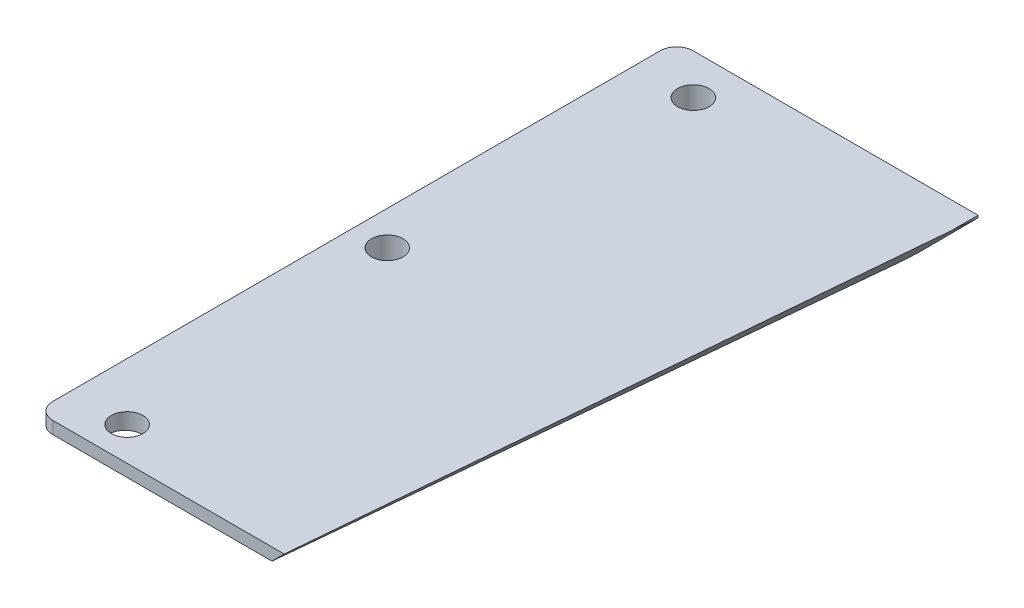
ISO-10303-21;
HEADER;
FILE_DESCRIPTION(('STEP AP214'),'2;1');
FILE_NAME('part.step','',(''),(''),'','','');
FILE_SCHEMA(('AUTOMOTIVE_DESIGN { 1 0 10303 214 1 1 1 1 }'));
ENDSEC;
DATA;
#1=APPLICATION_CONTEXT('core data for automotive mechanical design processes');
#2=APPLICATION_PROTOCOL_DEFINITION('international standard','automotive_design',2000,#1);
#3=PRODUCT_CONTEXT('',#1,'mechanical');
#4=PRODUCT('Part','Part','',(#3));
#5=PRODUCT_RELATED_PRODUCT_CATEGORY('part','',(#4));
#6=PRODUCT_DEFINITION_FORMATION('','',#4);
#7=PRODUCT_DEFINITION_CONTEXT('part definition',#1,'design');
#8=PRODUCT_DEFINITION('design','',#6,#7);
#9=PRODUCT_DEFINITION_SHAPE('','',#8);
#10=(LENGTH_UNIT() NAMED_UNIT(*) SI_UNIT(.MILLI.,.METRE.));
#11=(NAMED_UNIT(*) PLANE_ANGLE_UNIT() SI_UNIT($,.RADIAN.));
#12=(NAMED_UNIT(*) SI_UNIT($,.STERADIAN.) SOLID_ANGLE_UNIT());
#13=UNCERTAINTY_MEASURE_WITH_UNIT(LENGTH_MEASURE(1.E-05),#10,'distance_accuracy_value','');
#14=(GEOMETRIC_REPRESENTATION_CONTEXT(3) GLOBAL_UNCERTAINTY_ASSIGNED_CONTEXT((#13)) GLOBAL_UNIT_ASSIGNED_CONTEXT((#10,
#11,#12)) REPRESENTATION_CONTEXT('',''));
#15=CARTESIAN_POINT('',(0.,0.,0.));
#16=DIRECTION('',(0.,0.,1.));
#17=DIRECTION('',(1.,0.,0.));
#18=AXIS2_PLACEMENT_3D('',#15,#16,#17);
#19=CARTESIAN_POINT('',(-16.3293956239181,-151.252247056961,-104.155083501279));
#20=DIRECTION('',(1.,0.,0.));
#21=DIRECTION('',(0.,0.,-1.));
#22=AXIS2_PLACEMENT_3D('',#19,#20,#21);
#23=PLANE('',#22);
#24=DIRECTION('',(0.,1.,0.));
#25=VECTOR('',#24,1.);
#26=CARTESIAN_POINT('',(-16.3293956239181,-151.252247056961,-101.155083501279));
#27=LINE('',#26,#25);
#28=CARTESIAN_POINT('',(-16.3293956239181,-14.5,-101.155083501279));
#29=VERTEX_POINT('',#28);
#30=CARTESIAN_POINT('',(-16.3293956239181,-25.3162689580324,-101.155083501279));
#31=VERTEX_POINT('',#30);
#32=EDGE_CURVE('E132',#29,#31,#27,.F.);
#33=ORIENTED_EDGE('',*,*,#32,.T.);
#34=DIRECTION('',(0.,0.0871557427476512,0.996194698091746));
#35=VECTOR('',#34,1.);
#36=CARTESIAN_POINT('',(-16.3293956239181,-15.6285468939076,9.57608638633593));
#37=LINE('',#36,#35);
#38=CARTESIAN_POINT('',(-16.3293956239181,-15.6179891752357,9.69676166295296));
#39=VERTEX_POINT('',#38);
#40=EDGE_CURVE('E144',#31,#39,#37,.T.);
#41=ORIENTED_EDGE('',*,*,#40,.T.);
#42=DIRECTION('',(0.,1.,0.));
#43=VECTOR('',#42,1.);
#44=CARTESIAN_POINT('',(-16.3293956239181,-151.252247056961,9.69676166295296));
#45=LINE('',#44,#43);
#46=CARTESIAN_POINT('',(-16.3293956239181,-14.5,9.69676166295293));
#47=VERTEX_POINT('',#46);
#48=EDGE_CURVE('E136',#39,#47,#45,.T.);
#49=ORIENTED_EDGE('',*,*,#48,.T.);
#50=DIRECTION('',(0.,0.,-1.));
#51=VECTOR('',#50,1.);
#52=CARTESIAN_POINT('',(-16.3293956239181,-14.5,-104.155083501279));
#53=LINE('',#52,#51);
#54=EDGE_CURVE('E117',#47,#29,#53,.T.);
#55=ORIENTED_EDGE('',*,*,#54,.T.);
#56=EDGE_LOOP('',(#33,#41,#49,#55));
#57=FACE_BOUND('',#56,.T.);
#58=ADVANCED_FACE('F34',(#57),#23,.F.);
#59=CARTESIAN_POINT('',(-16.3293956239181,-151.252247056961,-104.155083501279));
#60=DIRECTION('',(0.,0.,1.));
#61=DIRECTION('',(1.,0.,0.));
#62=AXIS2_PLACEMENT_3D('',#59,#60,#61);
#63=PLANE('',#62);
#64=DIRECTION('',(0.,1.,0.));
#65=VECTOR('',#64,1.);
#66=CARTESIAN_POINT('',(38.6706043760819,-151.252247056961,-104.155083501279));
#67=LINE('',#66,#65);
#68=CARTESIAN_POINT('',(38.6706043760819,-14.9227793401485,-104.155083501279));
#69=VERTEX_POINT('',#68);
#70=CARTESIAN_POINT('',(38.6706043760819,-14.5,-104.155083501279));
#71=VERTEX_POINT('',#70);
#72=EDGE_CURVE('E104',#69,#71,#67,.T.);
#73=ORIENTED_EDGE('',*,*,#72,.F.);
#74=DIRECTION('',(-0.705757556807956,-0.708453436019943,0.));
#75=VECTOR('',#74,1.);
#76=CARTESIAN_POINT('',(31.2945843551041,-22.3269745593229,-104.155083501279));
#77=LINE('',#76,#75);
#78=CARTESIAN_POINT('',(28.1648964232193,-25.4686173906688,-104.155083501279));
#79=VERTEX_POINT('',#78);
#80=EDGE_CURVE('E44',#69,#79,#77,.T.);
#81=ORIENTED_EDGE('',*,*,#80,.T.);
#82=DIRECTION('',(-1.,0.,0.));
#83=VECTOR('',#82,1.);
#84=CARTESIAN_POINT('',(-13.3293956239181,-25.4686173906688,-104.155083501279));
#85=LINE('',#84,#83);
#86=CARTESIAN_POINT('',(-13.3293956239181,-25.4686173906688,-104.155083501279));
#87=VERTEX_POINT('',#86);
#88=EDGE_CURVE('E211',#79,#87,#85,.T.);
#89=ORIENTED_EDGE('',*,*,#88,.T.);
#90=DIRECTION('',(0.,1.,0.));
#91=VECTOR('',#90,1.);
#92=CARTESIAN_POINT('',(-13.3293956239181,-151.252247056961,-104.155083501279));
#93=LINE('',#92,#91);
#94=CARTESIAN_POINT('',(-13.3293956239181,-14.5,-104.155083501279));
#95=VERTEX_POINT('',#94);
#96=EDGE_CURVE('E114',#87,#95,#93,.T.);
#97=ORIENTED_EDGE('',*,*,#96,.T.);
#98=DIRECTION('',(1.,0.,0.));
#99=VECTOR('',#98,1.);
#100=CARTESIAN_POINT('',(-16.3293956239181,-14.5,-104.155083501279));
#101=LINE('',#100,#99);
#102=EDGE_CURVE('E109',#95,#71,#101,.T.);
#103=ORIENTED_EDGE('',*,*,#102,.T.);
#104=EDGE_LOOP('',(#73,#81,#89,#97,#103));
#105=FACE_BOUND('',#104,.T.);
#106=ADVANCED_FACE('F112',(#105),#63,.F.);
#107=CARTESIAN_POINT('',(38.6706043760819,-151.252247056961,-104.155083501279));
#108=DIRECTION('',(-1.,0.,0.));
#109=DIRECTION('',(0.,0.,1.));
#110=AXIS2_PLACEMENT_3D('',#107,#108,#109);
#111=PLANE('',#110);
#112=DIRECTION('',(0.,0.,1.));
#113=VECTOR('',#112,1.);
#114=CARTESIAN_POINT('',(38.6706043760819,-14.5,-104.155083501279));
#115=LINE('',#114,#113);
#116=CARTESIAN_POINT('',(38.6706043760819,-14.5,-99.3226935308539));
#117=VERTEX_POINT('',#116);
#118=EDGE_CURVE('E108',#71,#117,#115,.T.);
#119=ORIENTED_EDGE('',*,*,#118,.T.);
#120=DIRECTION('',(0.,-0.0871557427476512,-0.996194698091746));
#121=VECTOR('',#120,1.);
#122=CARTESIAN_POINT('',(38.6706043760819,-14.8936057369507,-103.821627690868));
#123=LINE('',#122,#121);
#124=EDGE_CURVE('E59',#117,#69,#123,.T.);
#125=ORIENTED_EDGE('',*,*,#124,.T.);
#126=ORIENTED_EDGE('',*,*,#72,.T.);
#127=EDGE_LOOP('',(#119,#125,#126));
#128=FACE_BOUND('',#127,.T.);
#129=ADVANCED_FACE('F106',(#128),#111,.F.);
#130=CARTESIAN_POINT('',(-16.3293956239181,-151.252247056961,12.696761662953));
#131=DIRECTION('',(0.,0.,-1.));
#132=DIRECTION('',(-1.,0.,0.));
#133=AXIS2_PLACEMENT_3D('',#130,#131,#132);
#134=PLANE('',#133);
#135=DIRECTION('',(-1.,0.,0.));
#136=VECTOR('',#135,1.);
#137=CARTESIAN_POINT('',(-16.3293956239181,-16.7454056267128,12.696761662953));
#138=LINE('',#137,#136);
#139=CARTESIAN_POINT('',(26.6706043760817,-16.7454056267128,12.6967616629529));
#140=VERTEX_POINT('',#139);
#141=CARTESIAN_POINT('',(-13.3293956239181,-16.7454056267128,12.696761662953));
#142=VERTEX_POINT('',#141);
#143=EDGE_CURVE('E125',#140,#142,#138,.T.);
#144=ORIENTED_EDGE('',*,*,#143,.F.);
#145=DIRECTION('',(0.705757556807956,0.708453436019943,0.));
#146=VECTOR('',#145,1.);
#147=CARTESIAN_POINT('',(26.183015623075,-17.2348568895439,12.6967616629529));
#148=LINE('',#147,#146);
#149=CARTESIAN_POINT('',(28.9074655564783,-14.5,12.6967616629529));
#150=VERTEX_POINT('',#149);
#151=EDGE_CURVE('E286',#140,#150,#148,.T.);
#152=ORIENTED_EDGE('',*,*,#151,.T.);
#153=DIRECTION('',(-1.,0.,0.));
#154=VECTOR('',#153,1.);
#155=CARTESIAN_POINT('',(-16.3293956239181,-14.5,12.696761662953));
#156=LINE('',#155,#154);
#157=CARTESIAN_POINT('',(-13.3293956239181,-14.5,12.696761662953));
#158=VERTEX_POINT('',#157);
#159=EDGE_CURVE('E123',#150,#158,#156,.T.);
#160=ORIENTED_EDGE('',*,*,#159,.T.);
#161=DIRECTION('',(0.,1.,0.));
#162=VECTOR('',#161,1.);
#163=CARTESIAN_POINT('',(-13.3293956239181,-151.252247056961,12.696761662953));
#164=LINE('',#163,#162);
#165=EDGE_CURVE('E306',#158,#142,#164,.F.);
#166=ORIENTED_EDGE('',*,*,#165,.T.);
#167=EDGE_LOOP('',(#144,#152,#160,#166));
#168=FACE_BOUND('',#167,.T.);
#169=ADVANCED_FACE('F289',(#168),#134,.F.);
#170=CARTESIAN_POINT('',(0.,-14.5,0.));
#171=DIRECTION('',(0.,1.,0.));
#172=DIRECTION('',(0.,0.,1.));
#173=AXIS2_PLACEMENT_3D('',#170,#171,#172);
#174=PLANE('',#173);
#175=CARTESIAN_POINT('',(-5.89885344473759,-14.5,-96.7709474931016));
#176=DIRECTION('',(0.,1.,0.));
#177=DIRECTION('',(0.,0.,1.));
#178=AXIS2_PLACEMENT_3D('',#175,#176,#177);
#179=CIRCLE('',#178,2.87500000000001);
#180=CARTESIAN_POINT('',(-5.89885344473759,-14.5,-93.8959474931016));
#181=VERTEX_POINT('',#180);
#182=EDGE_CURVE('E220',#181,#181,#179,.T.);
#183=ORIENTED_EDGE('',*,*,#182,.F.);
#184=EDGE_LOOP('',(#183));
#185=FACE_BOUND('',#184,.T.);
#186=CARTESIAN_POINT('',(-10.082989452915,-14.5,-45.1025417506395));
#187=DIRECTION('',(0.,1.,0.));
#188=DIRECTION('',(0.,0.,1.));
#189=AXIS2_PLACEMENT_3D('',#186,#187,#188);
#190=CIRCLE('',#189,2.875);
#191=CARTESIAN_POINT('',(-10.082989452915,-14.5,-42.2275417506395));
#192=VERTEX_POINT('',#191);
#193=EDGE_CURVE('E337',#192,#192,#190,.T.);
#194=ORIENTED_EDGE('',*,*,#193,.F.);
#195=EDGE_LOOP('',(#194));
#196=FACE_BOUND('',#195,.T.);
#197=CARTESIAN_POINT('',(-5.89885344473759,-14.5,6.56586399182263));
#198=DIRECTION('',(0.,1.,0.));
#199=DIRECTION('',(0.,0.,1.));
#200=AXIS2_PLACEMENT_3D('',#197,#198,#199);
#201=CIRCLE('',#200,2.875);
#202=CARTESIAN_POINT('',(-5.89885344473759,-14.5,9.44086399182263));
#203=VERTEX_POINT('',#202);
#204=EDGE_CURVE('E340',#203,#203,#201,.T.);
#205=ORIENTED_EDGE('',*,*,#204,.F.);
#206=EDGE_LOOP('',(#205));
#207=FACE_BOUND('',#206,.T.);
#208=ORIENTED_EDGE('',*,*,#159,.F.);
#209=DIRECTION('',(0.0868265938642417,0.,-0.996223440096615));
#210=VECTOR('',#209,1.);
#211=CARTESIAN_POINT('',(29.7877895218845,-14.5,2.59617692059058));
#212=LINE('',#211,#210);
#213=EDGE_CURVE('E122',#150,#117,#212,.T.);
#214=ORIENTED_EDGE('',*,*,#213,.T.);
#215=ORIENTED_EDGE('',*,*,#118,.F.);
#216=ORIENTED_EDGE('',*,*,#102,.F.);
#217=CARTESIAN_POINT('',(-13.3293956239181,-14.5,-101.155083501279));
#218=DIRECTION('',(0.,1.,0.));
#219=DIRECTION('',(0.,0.,1.));
#220=AXIS2_PLACEMENT_3D('',#217,#218,#219);
#221=CIRCLE('',#220,3.);
#222=EDGE_CURVE('E305',#95,#29,#221,.T.);
#223=ORIENTED_EDGE('',*,*,#222,.T.);
#224=ORIENTED_EDGE('',*,*,#54,.F.);
#225=CARTESIAN_POINT('',(-13.3293956239181,-14.5,9.69676166295296));
#226=DIRECTION('',(0.,1.,0.));
#227=DIRECTION('',(0.,0.,1.));
#228=AXIS2_PLACEMENT_3D('',#225,#226,#227);
#229=CIRCLE('',#228,3.);
#230=EDGE_CURVE('E296',#47,#158,#229,.T.);
#231=ORIENTED_EDGE('',*,*,#230,.T.);
#232=EDGE_LOOP('',(#208,#214,#215,#216,#223,#224,#231));
#233=FACE_BOUND('',#232,.T.);
#234=ADVANCED_FACE('F120',(#185,#196,#207,#233),#174,.T.);
#235=CARTESIAN_POINT('',(0.,-17.7205902201383,1.55035075525034));
#236=DIRECTION('',(0.,-0.996194698091746,0.0871557427476512));
#237=DIRECTION('',(0.,-0.0871557427476512,-0.996194698091746));
#238=AXIS2_PLACEMENT_3D('',#235,#236,#237);
#239=PLANE('',#238);
#240=CARTESIAN_POINT('',(-5.89885344473759,-26.3225892000197,-96.7709474931016));
#241=DIRECTION('',(0.,-0.996194698091746,0.0871557427476512));
#242=DIRECTION('',(0.,0.0871557427476512,0.996194698091746));
#243=AXIS2_PLACEMENT_3D('',#240,#241,#242);
#244=ELLIPSE('',#243,2.88598203293713,2.87500000000001);
#245=CARTESIAN_POINT('',(-5.89885344473759,-26.0710592923827,-93.8959474931016));
#246=VERTEX_POINT('',#245);
#247=EDGE_CURVE('E39',#246,#246,#244,.T.);
#248=ORIENTED_EDGE('',*,*,#247,.F.);
#249=EDGE_LOOP('',(#248));
#250=FACE_BOUND('',#249,.T.);
#251=CARTESIAN_POINT('',(-10.082989452915,-21.8021894350969,-45.1025417506395));
#252=DIRECTION('',(0.,-0.996194698091746,0.0871557427476512));
#253=DIRECTION('',(0.,0.0871557427476512,0.996194698091746));
#254=AXIS2_PLACEMENT_3D('',#251,#252,#253);
#255=ELLIPSE('',#254,2.88598203293712,2.875);
#256=CARTESIAN_POINT('',(-10.082989452915,-21.5506595274599,-42.2275417506395));
#257=VERTEX_POINT('',#256);
#258=EDGE_CURVE('E219',#257,#257,#255,.T.);
#259=ORIENTED_EDGE('',*,*,#258,.F.);
#260=EDGE_LOOP('',(#259));
#261=FACE_BOUND('',#260,.T.);
#262=CARTESIAN_POINT('',(-5.89885344473759,-17.2817896701741,6.56586399182263));
#263=DIRECTION('',(0.,-0.996194698091746,0.0871557427476512));
#264=DIRECTION('',(0.,0.0871557427476512,0.996194698091746));
#265=AXIS2_PLACEMENT_3D('',#262,#263,#264);
#266=ELLIPSE('',#265,2.88598203293712,2.875);
#267=CARTESIAN_POINT('',(-5.89885344473759,-17.0302597625371,9.44086399182263));
#268=VERTEX_POINT('',#267);
#269=EDGE_CURVE('E217',#268,#268,#266,.T.);
#270=ORIENTED_EDGE('',*,*,#269,.F.);
#271=EDGE_LOOP('',(#270));
#272=FACE_BOUND('',#271,.T.);
#273=DIRECTION('',(1.,0.,0.));
#274=VECTOR('',#273,1.);
#275=CARTESIAN_POINT('',(38.6706043760819,-26.8479421140517,-102.775758777896));
#276=LINE('',#275,#274);
#277=CARTESIAN_POINT('',(-13.3293956239181,-26.8479421140517,-102.775758777896));
#278=VERTEX_POINT('',#277);
#279=CARTESIAN_POINT('',(26.6706043760817,-26.8479421140517,-102.775758777896));
#280=VERTEX_POINT('',#279);
#281=EDGE_CURVE('E154',#278,#280,#276,.T.);
#282=ORIENTED_EDGE('',*,*,#281,.T.);
#283=DIRECTION('',(0.,0.0871557427476512,0.996194698091746));
#284=VECTOR('',#283,1.);
#285=CARTESIAN_POINT('',(26.6706043760817,-16.7454056267127,12.6967616629529));
#286=LINE('',#285,#284);
#287=EDGE_CURVE('E214',#280,#140,#286,.T.);
#288=ORIENTED_EDGE('',*,*,#287,.T.);
#289=ORIENTED_EDGE('',*,*,#143,.T.);
#290=CARTESIAN_POINT('',(-13.3293956239181,-17.0078716172905,9.69676166295296));
#291=DIRECTION('',(0.,-0.996194698091746,0.0871557427476512));
#292=DIRECTION('',(0.,0.0871557427476512,0.996194698091746));
#293=AXIS2_PLACEMENT_3D('',#290,#291,#292);
#294=ELLIPSE('',#293,3.01145951263004,3.);
#295=CARTESIAN_POINT('',(-15.0707461771522,-16.7941466742343,12.1396489404898));
#296=VERTEX_POINT('',#295);
#297=EDGE_CURVE('E155',#142,#296,#294,.T.);
#298=ORIENTED_EDGE('',*,*,#297,.T.);
#299=DIRECTION('',(0.,-0.0871557427476512,-0.996194698091746));
#300=VECTOR('',#299,1.);
#301=CARTESIAN_POINT('',(-15.0707461771522,-26.706151400091,-101.155083501279));
#302=LINE('',#301,#300);
#303=CARTESIAN_POINT('',(-15.0707461771522,-26.6955936814192,-101.034408224662));
#304=VERTEX_POINT('',#303);
#305=EDGE_CURVE('E147',#296,#304,#302,.T.);
#306=ORIENTED_EDGE('',*,*,#305,.T.);
#307=CARTESIAN_POINT('',(-13.3293956239181,-26.8479421140517,-102.775758777896));
#308=CARTESIAN_POINT('',(-13.4433673881188,-26.847942785842,-102.775766456494));
#309=CARTESIAN_POINT('',(-13.5573344351265,-26.8469600735437,-102.764534003525));
#310=CARTESIAN_POINT('',(-13.7808980930566,-26.8430694897317,-102.720064427066));
#311=CARTESIAN_POINT('',(-13.8904854501112,-26.8401611074735,-102.686821465739));
#312=CARTESIAN_POINT('',(-14.10107781105,-26.8325294528037,-102.599591253706));
#313=CARTESIAN_POINT('',(-14.2020740977382,-26.8278064962944,-102.545607613781));
#314=CARTESIAN_POINT('',(-14.3916022153562,-26.8167270509758,-102.418968974303));
#315=CARTESIAN_POINT('',(-14.4801262010199,-26.8103710207854,-102.34631921679));
#316=CARTESIAN_POINT('',(-14.6413066160459,-26.7962695616882,-102.185138801764));
#317=CARTESIAN_POINT('',(-14.7139563735606,-26.7885247164924,-102.096614816099));
#318=CARTESIAN_POINT('',(-14.8405950130364,-26.7719431547816,-101.907086698483));
#319=CARTESIAN_POINT('',(-14.8945786529629,-26.7631071246379,-101.806090411791));
#320=CARTESIAN_POINT('',(-14.9818088649938,-26.744682680431,-101.595498050858));
#321=CARTESIAN_POINT('',(-15.0150518263234,-26.7350950290224,-101.485910693797));
#322=CARTESIAN_POINT('',(-15.0595214027809,-26.7155357433778,-101.262347035874));
#323=CARTESIAN_POINT('',(-15.0707538557501,-26.7055649187488,-101.148379988862));
#324=CARTESIAN_POINT('',(-15.0707461771522,-26.6955936814192,-101.034408224662));
#325=B_SPLINE_CURVE_WITH_KNOTS('',3,(#307,#308,#309,#310,#311,#312,#313,#314,#315,#316,#317,
#318,#319,#320,#321,#322,#323,#324),.UNSPECIFIED.,.F.,.F.,(4,2,2,2,2,2,2,2,4),(1.5707963267949,
1.76714586764426,1.96349540849362,2.15984494934298,2.35619449019234,2.55254403104171,
2.74889357189107,2.94524311274043,3.14159265358979),.UNSPECIFIED.);
#326=EDGE_CURVE('E166',#304,#278,#325,.F.);
#327=ORIENTED_EDGE('',*,*,#326,.T.);
#328=EDGE_LOOP('',(#282,#288,#289,#298,#306,#327));
#329=FACE_BOUND('',#328,.T.);
#330=ADVANCED_FACE('F173',(#250,#261,#272,#329),#239,.T.);
#331=CARTESIAN_POINT('',(-13.3293956239181,-151.252247056961,9.69676166295296));
#332=DIRECTION('',(0.,1.,0.));
#333=DIRECTION('',(0.,0.,1.));
#334=AXIS2_PLACEMENT_3D('',#331,#332,#333);
#335=CYLINDRICAL_SURFACE('',#334,3.);
#336=ORIENTED_EDGE('',*,*,#48,.F.);
#337=CARTESIAN_POINT('',(-13.3293956239181,-18.9307839624405,9.69676166295296));
#338=DIRECTION('',(-0.739959207946653,-0.670092102418751,0.0586254624798884));
#339=DIRECTION('',(-0.667998844245384,0.742277962946509,0.0529241892787419));
#340=AXIS2_PLACEMENT_3D('',#337,#338,#339);
#341=ELLIPSE('',#340,4.476996504169,3.);
#342=EDGE_CURVE('E146',#39,#296,#341,.F.);
#343=ORIENTED_EDGE('',*,*,#342,.T.);
#344=ORIENTED_EDGE('',*,*,#297,.F.);
#345=ORIENTED_EDGE('',*,*,#165,.F.);
#346=ORIENTED_EDGE('',*,*,#230,.F.);
#347=EDGE_LOOP('',(#336,#343,#344,#345,#346));
#348=FACE_BOUND('',#347,.T.);
#349=ADVANCED_FACE('F183',(#348),#335,.T.);
#350=CARTESIAN_POINT('',(-13.3293956239181,-151.252247056961,-101.155083501279));
#351=DIRECTION('',(0.,1.,0.));
#352=DIRECTION('',(0.,0.,1.));
#353=AXIS2_PLACEMENT_3D('',#350,#351,#352);
#354=CYLINDRICAL_SURFACE('',#353,3.);
#355=ORIENTED_EDGE('',*,*,#96,.F.);
#356=CARTESIAN_POINT('',(-16.3293956239181,-25.3162689580362,-101.155083501279));
#357=CARTESIAN_POINT('',(-16.3294088526122,-25.3262401953658,-101.351434139562));
#358=CARTESIAN_POINT('',(-16.3100575744652,-25.3362110199947,-101.547776651066));
#359=CARTESIAN_POINT('',(-16.2334453557904,-25.3557703056396,-101.932932283589));
#360=CARTESIAN_POINT('',(-16.1761743578274,-25.365357957048,-102.121729462058));
#361=CARTESIAN_POINT('',(-16.0258940850766,-25.383782401255,-102.48453813469));
#362=CARTESIAN_POINT('',(-15.9328910309375,-25.3926184313986,-102.658534610879));
#363=CARTESIAN_POINT('',(-15.714717890714,-25.4091999931095,-102.985053789796));
#364=CARTESIAN_POINT('',(-15.5895568356131,-25.4169448383053,-103.137562976703));
#365=CARTESIAN_POINT('',(-15.3118750993425,-25.4310462974025,-103.415244712974));
#366=CARTESIAN_POINT('',(-15.1593659124363,-25.4374023275929,-103.540405768074));
#367=CARTESIAN_POINT('',(-14.8328467335175,-25.4484817729114,-103.758578908299));
#368=CARTESIAN_POINT('',(-14.658850257331,-25.4532047294207,-103.851581962437));
#369=CARTESIAN_POINT('',(-14.2960415846958,-25.4608363840905,-104.001862235189));
#370=CARTESIAN_POINT('',(-14.1072444062303,-25.4637447663488,-104.059133233151));
#371=CARTESIAN_POINT('',(-13.7220887737027,-25.4676353501607,-104.135745451826));
#372=CARTESIAN_POINT('',(-13.5257462622011,-25.4686180624591,-104.155096729973));
#373=CARTESIAN_POINT('',(-13.3293956239181,-25.4686173906688,-104.155083501279));
#374=B_SPLINE_CURVE_WITH_KNOTS('',3,(#356,#357,#358,#359,#360,#361,#362,#363,#364,#365,#366,
#367,#368,#369,#370,#371,#372,#373),.UNSPECIFIED.,.F.,.F.,(4,2,2,2,2,2,2,2,4),(1.5707963267949,
1.76714586764426,1.96349540849362,2.15984494934298,2.35619449019234,2.55254403104171,
2.74889357189107,2.94524311274043,3.14159265358979),.UNSPECIFIED.);
#375=EDGE_CURVE('E151',#87,#31,#374,.F.);
#376=ORIENTED_EDGE('',*,*,#375,.T.);
#377=ORIENTED_EDGE('',*,*,#32,.F.);
#378=ORIENTED_EDGE('',*,*,#222,.F.);
#379=EDGE_LOOP('',(#355,#376,#377,#378));
#380=FACE_BOUND('',#379,.T.);
#381=ADVANCED_FACE('F188',(#380),#354,.T.);
#382=CARTESIAN_POINT('',(0.,-26.8479421140517,-102.775758777896));
#383=DIRECTION('',(0.,-0.707106781186548,-0.707106781186548));
#384=DIRECTION('',(-1.,0.,0.));
#385=AXIS2_PLACEMENT_3D('',#382,#383,#384);
#386=PLANE('',#385);
#387=ORIENTED_EDGE('',*,*,#88,.F.);
#388=DIRECTION('',(-0.608120402411345,-0.561333045602637,0.561333045602637));
#389=VECTOR('',#388,1.);
#390=CARTESIAN_POINT('',(16.807536867989,-35.952168351732,-93.6715325402157));
#391=LINE('',#390,#389);
#392=EDGE_CURVE('E11',#79,#280,#391,.T.);
#393=ORIENTED_EDGE('',*,*,#392,.T.);
#394=ORIENTED_EDGE('',*,*,#281,.F.);
#395=CARTESIAN_POINT('',(-13.3293956239181,-25.4686173906688,-104.155083501279));
#396=CARTESIAN_POINT('',(-13.3293956239181,-26.8479421140517,-102.775758777896));
#397=B_SPLINE_CURVE_WITH_KNOTS('',1,(#395,#396),.UNSPECIFIED.,.F.,.F.,(2,2),(0.,1.),.UNSPECIFIED.);
#398=EDGE_CURVE('E131',#87,#278,#397,.T.);
#399=ORIENTED_EDGE('',*,*,#398,.F.);
#400=EDGE_LOOP('',(#387,#393,#394,#399));
#401=FACE_BOUND('',#400,.T.);
#402=ADVANCED_FACE('F193',(#401),#386,.T.);
#403=CARTESIAN_POINT('',(-15.0707461771522,-26.6955936814192,-101.034408224662));
#404=CARTESIAN_POINT('',(-15.0707538557501,-26.7055649187488,-101.148379988862));
#405=CARTESIAN_POINT('',(-15.0595214027809,-26.7155357433778,-101.262347035874));
#406=CARTESIAN_POINT('',(-15.0150518263234,-26.7350950290224,-101.485910693797));
#407=CARTESIAN_POINT('',(-14.9818088649938,-26.744682680431,-101.595498050858));
#408=CARTESIAN_POINT('',(-14.8945786529629,-26.7631071246379,-101.806090411791));
#409=CARTESIAN_POINT('',(-14.8405950130364,-26.7719431547816,-101.907086698483));
#410=CARTESIAN_POINT('',(-14.7139563735606,-26.7885247164924,-102.096614816099));
#411=CARTESIAN_POINT('',(-14.6413066160459,-26.7962695616882,-102.185138801764));
#412=CARTESIAN_POINT('',(-14.4801262010199,-26.8103710207854,-102.34631921679));
#413=CARTESIAN_POINT('',(-14.3916022153562,-26.8167270509758,-102.418968974303));
#414=CARTESIAN_POINT('',(-14.2020740977382,-26.8278064962944,-102.545607613781));
#415=CARTESIAN_POINT('',(-14.10107781105,-26.8325294528037,-102.599591253706));
#416=CARTESIAN_POINT('',(-13.8904854501112,-26.8401611074735,-102.686821465739));
#417=CARTESIAN_POINT('',(-13.7808980930566,-26.8430694897317,-102.720064427066));
#418=CARTESIAN_POINT('',(-13.5573344351265,-26.8469600735437,-102.764534003525));
#419=CARTESIAN_POINT('',(-13.4433673881188,-26.847942785842,-102.775766456494));
#420=CARTESIAN_POINT('',(-13.3293956239181,-26.8479421140517,-102.775758777896));
#421=CARTESIAN_POINT('',(-16.3293956239181,-25.3162689580362,-101.155083501279));
#422=CARTESIAN_POINT('',(-16.3294088526122,-25.3262401953658,-101.351434139562));
#423=CARTESIAN_POINT('',(-16.3100575744652,-25.3362110199947,-101.547776651066));
#424=CARTESIAN_POINT('',(-16.2334453557904,-25.3557703056396,-101.932932283589));
#425=CARTESIAN_POINT('',(-16.1761743578274,-25.365357957048,-102.121729462058));
#426=CARTESIAN_POINT('',(-16.0258940850766,-25.383782401255,-102.48453813469));
#427=CARTESIAN_POINT('',(-15.9328910309375,-25.3926184313986,-102.658534610879));
#428=CARTESIAN_POINT('',(-15.714717890714,-25.4091999931095,-102.985053789796));
#429=CARTESIAN_POINT('',(-15.5895568356131,-25.4169448383053,-103.137562976703));
#430=CARTESIAN_POINT('',(-15.3118750993425,-25.4310462974025,-103.415244712974));
#431=CARTESIAN_POINT('',(-15.1593659124363,-25.4374023275929,-103.540405768074));
#432=CARTESIAN_POINT('',(-14.8328467335175,-25.4484817729114,-103.758578908299));
#433=CARTESIAN_POINT('',(-14.658850257331,-25.4532047294207,-103.851581962437));
#434=CARTESIAN_POINT('',(-14.2960415846958,-25.4608363840905,-104.001862235189));
#435=CARTESIAN_POINT('',(-14.1072444062303,-25.4637447663488,-104.059133233151));
#436=CARTESIAN_POINT('',(-13.7220887737027,-25.4676353501607,-104.135745451826));
#437=CARTESIAN_POINT('',(-13.5257462622011,-25.4686180624591,-104.155096729973));
#438=CARTESIAN_POINT('',(-13.3293956239181,-25.4686173906688,-104.155083501279));
#439=B_SPLINE_SURFACE_WITH_KNOTS('',1,3,((#403,#404,#405,#406,#407,#408,#409,#410,#411,#412,
#413,#414,#415,#416,#417,#418,#419,#420),(#421,#422,#423,#424,#425,#426,#427,#428,#429,#430,
#431,#432,#433,#434,#435,#436,#437,#438)),.UNSPECIFIED.,.F.,.F.,.F.,(2,2),(4,2,2,2,2,2,2,2,4),
(0.,1.),(1.5707963267949,1.76714586764426,1.96349540849362,2.15984494934298,2.35619449019234,
2.55254403104171,2.74889357189107,2.94524311274043,3.14159265358979),.UNSPECIFIED.);
#440=CARTESIAN_POINT('',(-15.0707461771522,-26.6955936814192,-101.034408224662));
#441=CARTESIAN_POINT('',(-16.3293956239181,-25.3162689580362,-101.155083501279));
#442=B_SPLINE_CURVE_WITH_KNOTS('',1,(#440,#441),.UNSPECIFIED.,.F.,.F.,(2,2),(0.,1.),.UNSPECIFIED.);
#443=EDGE_CURVE('E225',#31,#304,#442,.F.);
#444=ORIENTED_EDGE('',*,*,#398,.T.);
#445=ORIENTED_EDGE('',*,*,#326,.F.);
#446=ORIENTED_EDGE('',*,*,#443,.F.);
#447=ORIENTED_EDGE('',*,*,#375,.F.);
#448=EDGE_LOOP('',(#444,#445,#446,#447));
#449=FACE_BOUND('',#448,.T.);
#450=ADVANCED_FACE('F237',(#449),#439,.T.);
#451=CARTESIAN_POINT('',(-15.0707461771522,-17.7205902201383,1.55035075525034));
#452=DIRECTION('',(-0.739959207946653,-0.670092102418751,0.0586254624798884));
#453=DIRECTION('',(0.,0.0871557427476512,0.996194698091746));
#454=AXIS2_PLACEMENT_3D('',#451,#452,#453);
#455=PLANE('',#454);
#456=ORIENTED_EDGE('',*,*,#342,.F.);
#457=ORIENTED_EDGE('',*,*,#40,.F.);
#458=ORIENTED_EDGE('',*,*,#443,.T.);
#459=ORIENTED_EDGE('',*,*,#305,.F.);
#460=EDGE_LOOP('',(#456,#457,#458,#459));
#461=FACE_BOUND('',#460,.T.);
#462=ADVANCED_FACE('F196',(#461),#455,.T.);
#463=CARTESIAN_POINT('',(26.6706043760817,-17.7205902201383,1.55035075525034));
#464=DIRECTION('',(0.707106781186543,-0.704416026402763,0.0616284167162148));
#465=DIRECTION('',(0.,-0.0871557427476512,-0.996194698091746));
#466=AXIS2_PLACEMENT_3D('',#463,#464,#465);
#467=PLANE('',#466);
#468=ORIENTED_EDGE('',*,*,#80,.F.);
#469=ORIENTED_EDGE('',*,*,#124,.F.);
#470=ORIENTED_EDGE('',*,*,#213,.F.);
#471=ORIENTED_EDGE('',*,*,#151,.F.);
#472=ORIENTED_EDGE('',*,*,#287,.F.);
#473=ORIENTED_EDGE('',*,*,#392,.F.);
#474=EDGE_LOOP('',(#468,#469,#470,#471,#472,#473));
#475=FACE_BOUND('',#474,.T.);
#476=ADVANCED_FACE('F37',(#475),#467,.T.);
#477=CARTESIAN_POINT('',(-5.89885344473759,-26.8485719448815,6.56586399182263));
#478=DIRECTION('',(0.,1.,0.));
#479=DIRECTION('',(0.,0.,1.));
#480=AXIS2_PLACEMENT_3D('',#477,#478,#479);
#481=CYLINDRICAL_SURFACE('',#480,2.875);
#482=ORIENTED_EDGE('',*,*,#269,.T.);
#483=EDGE_LOOP('',(#482));
#484=FACE_BOUND('',#483,.T.);
#485=ORIENTED_EDGE('',*,*,#204,.T.);
#486=EDGE_LOOP('',(#485));
#487=FACE_BOUND('',#486,.T.);
#488=ADVANCED_FACE('F323',(#484,#487),#481,.F.);
#489=CARTESIAN_POINT('',(-10.082989452915,-26.8485719448815,-45.1025417506395));
#490=DIRECTION('',(0.,1.,0.));
#491=DIRECTION('',(0.,0.,1.));
#492=AXIS2_PLACEMENT_3D('',#489,#490,#491);
#493=CYLINDRICAL_SURFACE('',#492,2.875);
#494=ORIENTED_EDGE('',*,*,#258,.T.);
#495=EDGE_LOOP('',(#494));
#496=FACE_BOUND('',#495,.T.);
#497=ORIENTED_EDGE('',*,*,#193,.T.);
#498=EDGE_LOOP('',(#497));
#499=FACE_BOUND('',#498,.T.);
#500=ADVANCED_FACE('F326',(#496,#499),#493,.F.);
#501=CARTESIAN_POINT('',(-5.89885344473759,-26.8485719448815,-96.7709474931016));
#502=DIRECTION('',(0.,1.,0.));
#503=DIRECTION('',(0.,0.,1.));
#504=AXIS2_PLACEMENT_3D('',#501,#502,#503);
#505=CYLINDRICAL_SURFACE('',#504,2.87500000000001);
#506=ORIENTED_EDGE('',*,*,#247,.T.);
#507=EDGE_LOOP('',(#506));
#508=FACE_BOUND('',#507,.T.);
#509=ORIENTED_EDGE('',*,*,#182,.T.);
#510=EDGE_LOOP('',(#509));
#511=FACE_BOUND('',#510,.T.);
#512=ADVANCED_FACE('F330',(#508,#511),#505,.F.);
#513=CLOSED_SHELL('',(#58,#106,#129,#169,#234,#330,#349,#381,#402,#450,#462,#476,#488,#500,#512));
#514=MANIFOLD_SOLID_BREP('B2',#513);
#515=ADVANCED_BREP_SHAPE_REPRESENTATION('',(#18,#514),#14);
#516=SHAPE_DEFINITION_REPRESENTATION(#9,#515);
ENDSEC;
END-ISO-10303-21;
